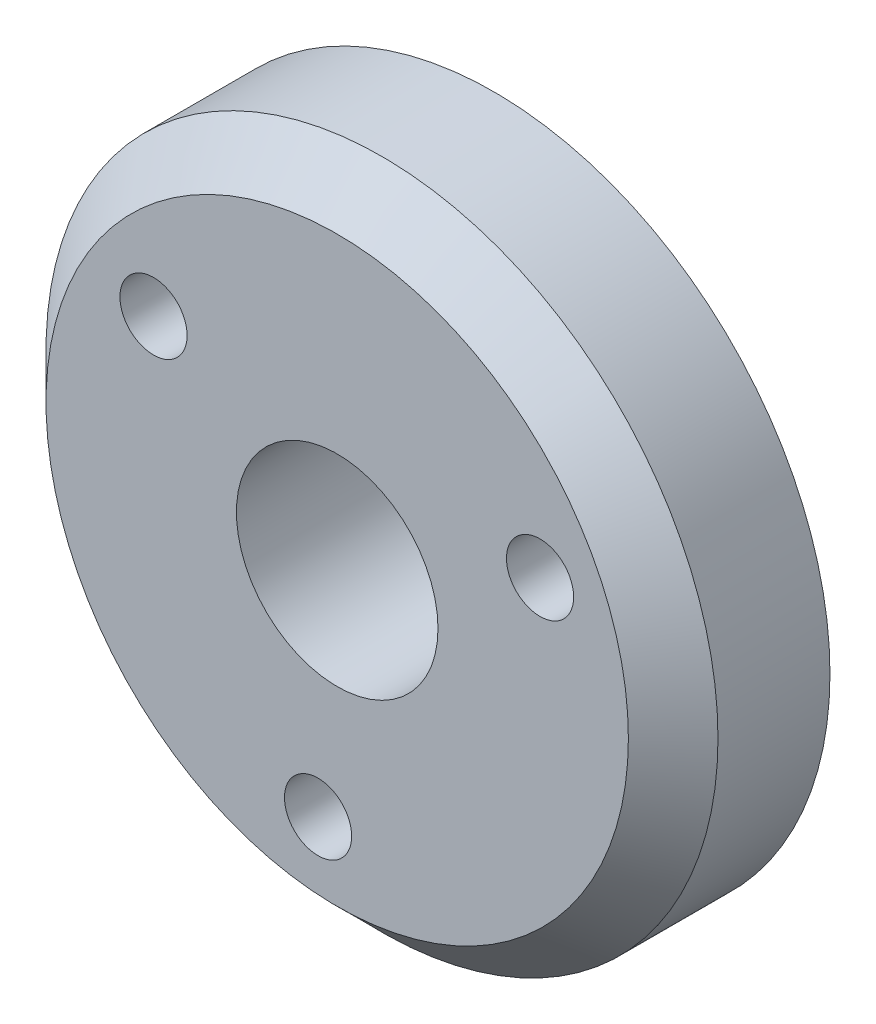
ISO-10303-21;
HEADER;
FILE_DESCRIPTION(('STEP AP214'),'2;1');
FILE_NAME('part.step','',(''),(''),'','','');
FILE_SCHEMA(('AUTOMOTIVE_DESIGN { 1 0 10303 214 1 1 1 1 }'));
ENDSEC;
DATA;
#1=APPLICATION_CONTEXT('core data for automotive mechanical design processes');
#2=APPLICATION_PROTOCOL_DEFINITION('international standard','automotive_design',2000,#1);
#3=PRODUCT_CONTEXT('',#1,'mechanical');
#4=PRODUCT('Part','Part','',(#3));
#5=PRODUCT_RELATED_PRODUCT_CATEGORY('part','',(#4));
#6=PRODUCT_DEFINITION_FORMATION('','',#4);
#7=PRODUCT_DEFINITION_CONTEXT('part definition',#1,'design');
#8=PRODUCT_DEFINITION('design','',#6,#7);
#9=PRODUCT_DEFINITION_SHAPE('','',#8);
#10=(LENGTH_UNIT() NAMED_UNIT(*) SI_UNIT(.MILLI.,.METRE.));
#11=(NAMED_UNIT(*) PLANE_ANGLE_UNIT() SI_UNIT($,.RADIAN.));
#12=(NAMED_UNIT(*) SI_UNIT($,.STERADIAN.) SOLID_ANGLE_UNIT());
#13=UNCERTAINTY_MEASURE_WITH_UNIT(LENGTH_MEASURE(1.E-05),#10,'distance_accuracy_value','');
#14=(GEOMETRIC_REPRESENTATION_CONTEXT(3) GLOBAL_UNCERTAINTY_ASSIGNED_CONTEXT((#13)) GLOBAL_UNIT_ASSIGNED_CONTEXT((#10,
#11,#12)) REPRESENTATION_CONTEXT('',''));
#15=CARTESIAN_POINT('',(0.,0.,0.));
#16=DIRECTION('',(0.,0.,1.));
#17=DIRECTION('',(1.,0.,0.));
#18=AXIS2_PLACEMENT_3D('',#15,#16,#17);
#19=CARTESIAN_POINT('',(0.,0.,7.));
#20=DIRECTION('',(0.,0.,1.));
#21=DIRECTION('',(1.,0.,0.));
#22=AXIS2_PLACEMENT_3D('',#19,#20,#21);
#23=PLANE('',#22);
#24=CARTESIAN_POINT('',(0.,0.,7.));
#25=DIRECTION('',(0.,0.,1.));
#26=DIRECTION('',(1.,0.,0.));
#27=AXIS2_PLACEMENT_3D('',#24,#25,#26);
#28=CIRCLE('',#27,13.);
#29=CARTESIAN_POINT('',(13.,0.,7.));
#30=VERTEX_POINT('',#29);
#31=EDGE_CURVE('E35',#30,#30,#28,.T.);
#32=ORIENTED_EDGE('',*,*,#31,.T.);
#33=EDGE_LOOP('',(#32));
#34=FACE_BOUND('',#33,.T.);
#35=CARTESIAN_POINT('',(9.05611823612466,4.24107562928679,7.));
#36=DIRECTION('',(0.,0.,1.));
#37=DIRECTION('',(1.,0.,0.));
#38=AXIS2_PLACEMENT_3D('',#35,#36,#37);
#39=CIRCLE('',#38,1.5);
#40=CARTESIAN_POINT('',(10.5561182361247,4.24107562928679,7.));
#41=VERTEX_POINT('',#40);
#42=EDGE_CURVE('E60',#41,#41,#39,.T.);
#43=ORIENTED_EDGE('',*,*,#42,.F.);
#44=EDGE_LOOP('',(#43));
#45=FACE_BOUND('',#44,.T.);
#46=CARTESIAN_POINT('',(0.,0.,7.));
#47=DIRECTION('',(0.,0.,1.));
#48=DIRECTION('',(1.,0.,0.));
#49=AXIS2_PLACEMENT_3D('',#46,#47,#48);
#50=CIRCLE('',#49,4.5);
#51=CARTESIAN_POINT('',(4.5,0.,7.));
#52=VERTEX_POINT('',#51);
#53=EDGE_CURVE('E43',#52,#52,#50,.T.);
#54=ORIENTED_EDGE('',*,*,#53,.F.);
#55=EDGE_LOOP('',(#54));
#56=FACE_BOUND('',#55,.T.);
#57=CARTESIAN_POINT('',(-8.20093835239579,5.72229063751605,7.));
#58=DIRECTION('',(0.,0.,1.));
#59=DIRECTION('',(1.,0.,0.));
#60=AXIS2_PLACEMENT_3D('',#57,#58,#59);
#61=CIRCLE('',#60,1.5);
#62=CARTESIAN_POINT('',(-6.70093835239579,5.72229063751605,7.));
#63=VERTEX_POINT('',#62);
#64=EDGE_CURVE('E54',#63,#63,#61,.T.);
#65=ORIENTED_EDGE('',*,*,#64,.F.);
#66=EDGE_LOOP('',(#65));
#67=FACE_BOUND('',#66,.T.);
#68=CARTESIAN_POINT('',(-0.855179883728945,-9.96336626680287,7.));
#69=DIRECTION('',(0.,0.,1.));
#70=DIRECTION('',(1.,0.,0.));
#71=AXIS2_PLACEMENT_3D('',#68,#69,#70);
#72=CIRCLE('',#71,1.5);
#73=CARTESIAN_POINT('',(0.644820116271055,-9.96336626680287,7.));
#74=VERTEX_POINT('',#73);
#75=EDGE_CURVE('E66',#74,#74,#72,.T.);
#76=ORIENTED_EDGE('',*,*,#75,.F.);
#77=EDGE_LOOP('',(#76));
#78=FACE_BOUND('',#77,.T.);
#79=ADVANCED_FACE('F28',(#34,#45,#56,#67,#78),#23,.T.);
#80=CARTESIAN_POINT('',(0.,0.,0.));
#81=DIRECTION('',(0.,0.,1.));
#82=DIRECTION('',(1.,0.,0.));
#83=AXIS2_PLACEMENT_3D('',#80,#81,#82);
#84=PLANE('',#83);
#85=CARTESIAN_POINT('',(9.05611823612466,4.24107562928679,0.));
#86=DIRECTION('',(0.,0.,1.));
#87=DIRECTION('',(1.,0.,0.));
#88=AXIS2_PLACEMENT_3D('',#85,#86,#87);
#89=CIRCLE('',#88,1.5);
#90=CARTESIAN_POINT('',(10.5561182361247,4.24107562928679,0.));
#91=VERTEX_POINT('',#90);
#92=EDGE_CURVE('E57',#91,#91,#89,.T.);
#93=ORIENTED_EDGE('',*,*,#92,.T.);
#94=EDGE_LOOP('',(#93));
#95=FACE_BOUND('',#94,.T.);
#96=CARTESIAN_POINT('',(0.,0.,0.));
#97=DIRECTION('',(0.,0.,1.));
#98=DIRECTION('',(1.,0.,0.));
#99=AXIS2_PLACEMENT_3D('',#96,#97,#98);
#100=CIRCLE('',#99,4.5);
#101=CARTESIAN_POINT('',(4.5,0.,0.));
#102=VERTEX_POINT('',#101);
#103=EDGE_CURVE('E48',#102,#102,#100,.T.);
#104=ORIENTED_EDGE('',*,*,#103,.T.);
#105=EDGE_LOOP('',(#104));
#106=FACE_BOUND('',#105,.T.);
#107=CARTESIAN_POINT('',(0.,0.,0.));
#108=DIRECTION('',(0.,0.,1.));
#109=DIRECTION('',(1.,0.,0.));
#110=AXIS2_PLACEMENT_3D('',#107,#108,#109);
#111=CIRCLE('',#110,15.);
#112=CARTESIAN_POINT('',(15.,0.,0.));
#113=VERTEX_POINT('',#112);
#114=EDGE_CURVE('E39',#113,#113,#111,.T.);
#115=ORIENTED_EDGE('',*,*,#114,.F.);
#116=EDGE_LOOP('',(#115));
#117=FACE_BOUND('',#116,.T.);
#118=CARTESIAN_POINT('',(-8.20093835239579,5.72229063751605,0.));
#119=DIRECTION('',(0.,0.,1.));
#120=DIRECTION('',(1.,0.,0.));
#121=AXIS2_PLACEMENT_3D('',#118,#119,#120);
#122=CIRCLE('',#121,1.5);
#123=CARTESIAN_POINT('',(-6.70093835239579,5.72229063751605,0.));
#124=VERTEX_POINT('',#123);
#125=EDGE_CURVE('E51',#124,#124,#122,.T.);
#126=ORIENTED_EDGE('',*,*,#125,.T.);
#127=EDGE_LOOP('',(#126));
#128=FACE_BOUND('',#127,.T.);
#129=CARTESIAN_POINT('',(-0.855179883728945,-9.96336626680287,0.));
#130=DIRECTION('',(0.,0.,1.));
#131=DIRECTION('',(1.,0.,0.));
#132=AXIS2_PLACEMENT_3D('',#129,#130,#131);
#133=CIRCLE('',#132,1.5);
#134=CARTESIAN_POINT('',(0.644820116271054,-9.96336626680287,0.));
#135=VERTEX_POINT('',#134);
#136=EDGE_CURVE('E63',#135,#135,#133,.T.);
#137=ORIENTED_EDGE('',*,*,#136,.T.);
#138=EDGE_LOOP('',(#137));
#139=FACE_BOUND('',#138,.T.);
#140=ADVANCED_FACE('F74',(#95,#106,#117,#128,#139),#84,.F.);
#141=CARTESIAN_POINT('',(0.,0.,7.));
#142=DIRECTION('',(0.,0.,-1.));
#143=DIRECTION('',(-1.,0.,0.));
#144=AXIS2_PLACEMENT_3D('',#141,#142,#143);
#145=CYLINDRICAL_SURFACE('',#144,15.);
#146=CARTESIAN_POINT('',(0.,0.,4.99999999999999));
#147=DIRECTION('',(0.,0.,1.));
#148=DIRECTION('',(1.,0.,0.));
#149=AXIS2_PLACEMENT_3D('',#146,#147,#148);
#150=CIRCLE('',#149,15.);
#151=CARTESIAN_POINT('',(15.,0.,4.99999999999999));
#152=VERTEX_POINT('',#151);
#153=EDGE_CURVE('E10',#152,#152,#150,.F.);
#154=ORIENTED_EDGE('',*,*,#153,.T.);
#155=EDGE_LOOP('',(#154));
#156=FACE_BOUND('',#155,.T.);
#157=ORIENTED_EDGE('',*,*,#114,.T.);
#158=EDGE_LOOP('',(#157));
#159=FACE_BOUND('',#158,.T.);
#160=ADVANCED_FACE('F30',(#156,#159),#145,.T.);
#161=CARTESIAN_POINT('',(0.,0.,7.));
#162=DIRECTION('',(0.,0.,-1.));
#163=DIRECTION('',(-1.,0.,0.));
#164=AXIS2_PLACEMENT_3D('',#161,#162,#163);
#165=CYLINDRICAL_SURFACE('',#164,4.5);
#166=ORIENTED_EDGE('',*,*,#53,.T.);
#167=EDGE_LOOP('',(#166));
#168=FACE_BOUND('',#167,.T.);
#169=ORIENTED_EDGE('',*,*,#103,.F.);
#170=EDGE_LOOP('',(#169));
#171=FACE_BOUND('',#170,.T.);
#172=ADVANCED_FACE('F82',(#168,#171),#165,.F.);
#173=CARTESIAN_POINT('',(-8.20093835239579,5.72229063751605,7.));
#174=DIRECTION('',(0.,0.,1.));
#175=DIRECTION('',(1.,0.,0.));
#176=AXIS2_PLACEMENT_3D('',#173,#174,#175);
#177=CYLINDRICAL_SURFACE('',#176,1.5);
#178=ORIENTED_EDGE('',*,*,#64,.T.);
#179=EDGE_LOOP('',(#178));
#180=FACE_BOUND('',#179,.T.);
#181=ORIENTED_EDGE('',*,*,#125,.F.);
#182=EDGE_LOOP('',(#181));
#183=FACE_BOUND('',#182,.T.);
#184=ADVANCED_FACE('F85',(#180,#183),#177,.F.);
#185=CARTESIAN_POINT('',(9.05611823612466,4.24107562928679,7.));
#186=DIRECTION('',(0.,0.,1.));
#187=DIRECTION('',(1.,0.,0.));
#188=AXIS2_PLACEMENT_3D('',#185,#186,#187);
#189=CYLINDRICAL_SURFACE('',#188,1.5);
#190=ORIENTED_EDGE('',*,*,#42,.T.);
#191=EDGE_LOOP('',(#190));
#192=FACE_BOUND('',#191,.T.);
#193=ORIENTED_EDGE('',*,*,#92,.F.);
#194=EDGE_LOOP('',(#193));
#195=FACE_BOUND('',#194,.T.);
#196=ADVANCED_FACE('F89',(#192,#195),#189,.F.);
#197=CARTESIAN_POINT('',(-0.855179883728945,-9.96336626680287,7.));
#198=DIRECTION('',(0.,0.,1.));
#199=DIRECTION('',(1.,0.,0.));
#200=AXIS2_PLACEMENT_3D('',#197,#198,#199);
#201=CYLINDRICAL_SURFACE('',#200,1.5);
#202=ORIENTED_EDGE('',*,*,#75,.T.);
#203=EDGE_LOOP('',(#202));
#204=FACE_BOUND('',#203,.T.);
#205=ORIENTED_EDGE('',*,*,#136,.F.);
#206=EDGE_LOOP('',(#205));
#207=FACE_BOUND('',#206,.T.);
#208=ADVANCED_FACE('F70',(#204,#207),#201,.F.);
#209=CARTESIAN_POINT('',(0.,0.,7.));
#210=DIRECTION('',(0.,0.,-1.));
#211=DIRECTION('',(-1.,0.,0.));
#212=AXIS2_PLACEMENT_3D('',#209,#210,#211);
#213=CONICAL_SURFACE('',#212,13.,0.785398163397453);
#214=ORIENTED_EDGE('',*,*,#153,.F.);
#215=EDGE_LOOP('',(#214));
#216=FACE_BOUND('',#215,.T.);
#217=ORIENTED_EDGE('',*,*,#31,.F.);
#218=EDGE_LOOP('',(#217));
#219=FACE_BOUND('',#218,.T.);
#220=ADVANCED_FACE('F96',(#216,#219),#213,.T.);
#221=CLOSED_SHELL('',(#79,#140,#160,#172,#184,#196,#208,#220));
#222=MANIFOLD_SOLID_BREP('B2',#221);
#223=ADVANCED_BREP_SHAPE_REPRESENTATION('',(#18,#222),#14);
#224=SHAPE_DEFINITION_REPRESENTATION(#9,#223);
ENDSEC;
END-ISO-10303-21;
